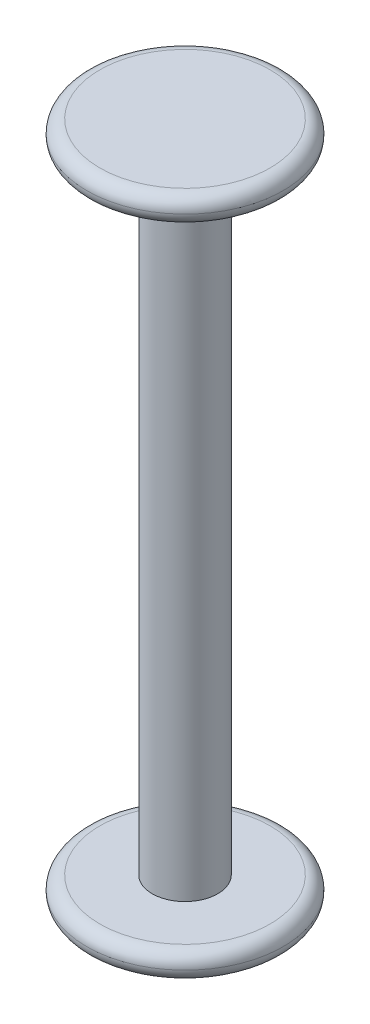
ISO-10303-21;
HEADER;
FILE_DESCRIPTION(('STEP AP214'),'2;1');
FILE_NAME('part.step','',(''),(''),'','','');
FILE_SCHEMA(('AUTOMOTIVE_DESIGN { 1 0 10303 214 1 1 1 1 }'));
ENDSEC;
DATA;
#1=APPLICATION_CONTEXT('core data for automotive mechanical design processes');
#2=APPLICATION_PROTOCOL_DEFINITION('international standard','automotive_design',2000,#1);
#3=PRODUCT_CONTEXT('',#1,'mechanical');
#4=PRODUCT('Part','Part','',(#3));
#5=PRODUCT_RELATED_PRODUCT_CATEGORY('part','',(#4));
#6=PRODUCT_DEFINITION_FORMATION('','',#4);
#7=PRODUCT_DEFINITION_CONTEXT('part definition',#1,'design');
#8=PRODUCT_DEFINITION('design','',#6,#7);
#9=PRODUCT_DEFINITION_SHAPE('','',#8);
#10=(LENGTH_UNIT() NAMED_UNIT(*) SI_UNIT(.MILLI.,.METRE.));
#11=(NAMED_UNIT(*) PLANE_ANGLE_UNIT() SI_UNIT($,.RADIAN.));
#12=(NAMED_UNIT(*) SI_UNIT($,.STERADIAN.) SOLID_ANGLE_UNIT());
#13=UNCERTAINTY_MEASURE_WITH_UNIT(LENGTH_MEASURE(1.E-05),#10,'distance_accuracy_value','');
#14=(GEOMETRIC_REPRESENTATION_CONTEXT(3) GLOBAL_UNCERTAINTY_ASSIGNED_CONTEXT((#13)) GLOBAL_UNIT_ASSIGNED_CONTEXT((#10,
#11,#12)) REPRESENTATION_CONTEXT('',''));
#15=CARTESIAN_POINT('',(0.,0.,0.));
#16=DIRECTION('',(0.,0.,1.));
#17=DIRECTION('',(1.,0.,0.));
#18=AXIS2_PLACEMENT_3D('',#15,#16,#17);
#19=CARTESIAN_POINT('',(0.,24.,0.));
#20=DIRECTION('',(0.,-1.,0.));
#21=DIRECTION('',(0.,0.,-1.));
#22=AXIS2_PLACEMENT_3D('',#19,#20,#21);
#23=CYLINDRICAL_SURFACE('',#22,2.5);
#24=CARTESIAN_POINT('',(0.,24.,0.));
#25=DIRECTION('',(0.,1.,0.));
#26=DIRECTION('',(0.,0.,1.));
#27=AXIS2_PLACEMENT_3D('',#24,#25,#26);
#28=CIRCLE('',#27,2.5);
#29=CARTESIAN_POINT('',(0.,24.,2.5));
#30=VERTEX_POINT('',#29);
#31=EDGE_CURVE('E43',#30,#30,#28,.T.);
#32=ORIENTED_EDGE('',*,*,#31,.F.);
#33=EDGE_LOOP('',(#32));
#34=FACE_BOUND('',#33,.T.);
#35=CARTESIAN_POINT('',(0.,-24.,0.));
#36=DIRECTION('',(0.,1.,0.));
#37=DIRECTION('',(0.,0.,1.));
#38=AXIS2_PLACEMENT_3D('',#35,#36,#37);
#39=CIRCLE('',#38,2.5);
#40=CARTESIAN_POINT('',(0.,-24.,2.5));
#41=VERTEX_POINT('',#40);
#42=EDGE_CURVE('E51',#41,#41,#39,.T.);
#43=ORIENTED_EDGE('',*,*,#42,.T.);
#44=EDGE_LOOP('',(#43));
#45=FACE_BOUND('',#44,.T.);
#46=ADVANCED_FACE('F31',(#34,#45),#23,.T.);
#47=CARTESIAN_POINT('',(0.,26.,0.));
#48=DIRECTION('',(0.,1.,0.));
#49=DIRECTION('',(0.,0.,1.));
#50=AXIS2_PLACEMENT_3D('',#47,#48,#49);
#51=PLANE('',#50);
#52=CARTESIAN_POINT('',(0.,26.,0.));
#53=DIRECTION('',(0.,1.,0.));
#54=DIRECTION('',(0.,0.,1.));
#55=AXIS2_PLACEMENT_3D('',#52,#53,#54);
#56=CIRCLE('',#55,6.5);
#57=CARTESIAN_POINT('',(0.,26.,6.5));
#58=VERTEX_POINT('',#57);
#59=EDGE_CURVE('E39',#58,#58,#56,.T.);
#60=ORIENTED_EDGE('',*,*,#59,.T.);
#61=EDGE_LOOP('',(#60));
#62=FACE_BOUND('',#61,.T.);
#63=ADVANCED_FACE('F81',(#62),#51,.T.);
#64=CARTESIAN_POINT('',(0.,24.,0.));
#65=DIRECTION('',(0.,1.,0.));
#66=DIRECTION('',(0.,0.,1.));
#67=AXIS2_PLACEMENT_3D('',#64,#65,#66);
#68=PLANE('',#67);
#69=CARTESIAN_POINT('',(0.,24.,0.));
#70=DIRECTION('',(0.,1.,0.));
#71=DIRECTION('',(0.,0.,1.));
#72=AXIS2_PLACEMENT_3D('',#69,#70,#71);
#73=CIRCLE('',#72,6.5);
#74=CARTESIAN_POINT('',(0.,24.,6.5));
#75=VERTEX_POINT('',#74);
#76=EDGE_CURVE('E10',#75,#75,#73,.F.);
#77=ORIENTED_EDGE('',*,*,#76,.T.);
#78=EDGE_LOOP('',(#77));
#79=FACE_BOUND('',#78,.T.);
#80=ORIENTED_EDGE('',*,*,#31,.T.);
#81=EDGE_LOOP('',(#80));
#82=FACE_BOUND('',#81,.T.);
#83=ADVANCED_FACE('F87',(#79,#82),#68,.F.);
#84=CARTESIAN_POINT('',(0.,25.,0.));
#85=DIRECTION('',(0.,1.,0.));
#86=DIRECTION('',(0.,0.,1.));
#87=AXIS2_PLACEMENT_3D('',#84,#85,#86);
#88=TOROIDAL_SURFACE('',#87,6.5,1.);
#89=ORIENTED_EDGE('',*,*,#76,.F.);
#90=EDGE_LOOP('',(#89));
#91=FACE_BOUND('',#90,.T.);
#92=CARTESIAN_POINT('',(0.,25.,0.));
#93=DIRECTION('',(0.,1.,0.));
#94=DIRECTION('',(0.,0.,1.));
#95=AXIS2_PLACEMENT_3D('',#92,#93,#94);
#96=CIRCLE('',#95,7.5);
#97=CARTESIAN_POINT('',(0.,25.,7.5));
#98=VERTEX_POINT('',#97);
#99=EDGE_CURVE('E35',#98,#98,#96,.T.);
#100=ORIENTED_EDGE('',*,*,#99,.F.);
#101=EDGE_LOOP('',(#100));
#102=FACE_BOUND('',#101,.T.);
#103=ADVANCED_FACE('F33',(#91,#102),#88,.T.);
#104=CARTESIAN_POINT('',(0.,25.,0.));
#105=DIRECTION('',(0.,1.,0.));
#106=DIRECTION('',(0.,0.,1.));
#107=AXIS2_PLACEMENT_3D('',#104,#105,#106);
#108=TOROIDAL_SURFACE('',#107,6.5,1.);
#109=ORIENTED_EDGE('',*,*,#99,.T.);
#110=EDGE_LOOP('',(#109));
#111=FACE_BOUND('',#110,.T.);
#112=ORIENTED_EDGE('',*,*,#59,.F.);
#113=EDGE_LOOP('',(#112));
#114=FACE_BOUND('',#113,.T.);
#115=ADVANCED_FACE('F75',(#111,#114),#108,.T.);
#116=CARTESIAN_POINT('',(0.,-26.,0.));
#117=DIRECTION('',(0.,-1.,0.));
#118=DIRECTION('',(0.,0.,1.));
#119=AXIS2_PLACEMENT_3D('',#116,#117,#118);
#120=PLANE('',#119);
#121=CARTESIAN_POINT('',(0.,-26.,0.));
#122=DIRECTION('',(0.,1.,0.));
#123=DIRECTION('',(0.,0.,1.));
#124=AXIS2_PLACEMENT_3D('',#121,#122,#123);
#125=CIRCLE('',#124,6.5);
#126=CARTESIAN_POINT('',(0.,-26.,6.5));
#127=VERTEX_POINT('',#126);
#128=EDGE_CURVE('E55',#127,#127,#125,.T.);
#129=ORIENTED_EDGE('',*,*,#128,.F.);
#130=EDGE_LOOP('',(#129));
#131=FACE_BOUND('',#130,.T.);
#132=ADVANCED_FACE('F65',(#131),#120,.T.);
#133=CARTESIAN_POINT('',(0.,-24.,0.));
#134=DIRECTION('',(0.,-1.,0.));
#135=DIRECTION('',(0.,0.,1.));
#136=AXIS2_PLACEMENT_3D('',#133,#134,#135);
#137=PLANE('',#136);
#138=CARTESIAN_POINT('',(0.,-24.,0.));
#139=DIRECTION('',(0.,1.,0.));
#140=DIRECTION('',(0.,0.,1.));
#141=AXIS2_PLACEMENT_3D('',#138,#139,#140);
#142=CIRCLE('',#141,6.5);
#143=CARTESIAN_POINT('',(0.,-24.,6.5));
#144=VERTEX_POINT('',#143);
#145=EDGE_CURVE('E52',#144,#144,#142,.F.);
#146=ORIENTED_EDGE('',*,*,#145,.F.);
#147=EDGE_LOOP('',(#146));
#148=FACE_BOUND('',#147,.T.);
#149=ORIENTED_EDGE('',*,*,#42,.F.);
#150=EDGE_LOOP('',(#149));
#151=FACE_BOUND('',#150,.T.);
#152=ADVANCED_FACE('F62',(#148,#151),#137,.F.);
#153=CARTESIAN_POINT('',(0.,-25.,0.));
#154=DIRECTION('',(0.,-1.,0.));
#155=DIRECTION('',(0.,0.,1.));
#156=AXIS2_PLACEMENT_3D('',#153,#154,#155);
#157=TOROIDAL_SURFACE('',#156,6.5,1.);
#158=ORIENTED_EDGE('',*,*,#145,.T.);
#159=EDGE_LOOP('',(#158));
#160=FACE_BOUND('',#159,.T.);
#161=CARTESIAN_POINT('',(0.,-25.,0.));
#162=DIRECTION('',(0.,1.,0.));
#163=DIRECTION('',(0.,0.,1.));
#164=AXIS2_PLACEMENT_3D('',#161,#162,#163);
#165=CIRCLE('',#164,7.5);
#166=CARTESIAN_POINT('',(0.,-25.,7.5));
#167=VERTEX_POINT('',#166);
#168=EDGE_CURVE('E48',#167,#167,#165,.T.);
#169=ORIENTED_EDGE('',*,*,#168,.T.);
#170=EDGE_LOOP('',(#169));
#171=FACE_BOUND('',#170,.T.);
#172=ADVANCED_FACE('F64',(#160,#171),#157,.T.);
#173=CARTESIAN_POINT('',(0.,-25.,0.));
#174=DIRECTION('',(0.,-1.,0.));
#175=DIRECTION('',(0.,0.,1.));
#176=AXIS2_PLACEMENT_3D('',#173,#174,#175);
#177=TOROIDAL_SURFACE('',#176,6.5,1.);
#178=ORIENTED_EDGE('',*,*,#168,.F.);
#179=EDGE_LOOP('',(#178));
#180=FACE_BOUND('',#179,.T.);
#181=ORIENTED_EDGE('',*,*,#128,.T.);
#182=EDGE_LOOP('',(#181));
#183=FACE_BOUND('',#182,.T.);
#184=ADVANCED_FACE('F72',(#180,#183),#177,.T.);
#185=CLOSED_SHELL('',(#46,#63,#83,#103,#115,#132,#152,#172,#184));
#186=MANIFOLD_SOLID_BREP('B2',#185);
#187=ADVANCED_BREP_SHAPE_REPRESENTATION('',(#18,#186),#14);
#188=SHAPE_DEFINITION_REPRESENTATION(#9,#187);
ENDSEC;
END-ISO-10303-21;
